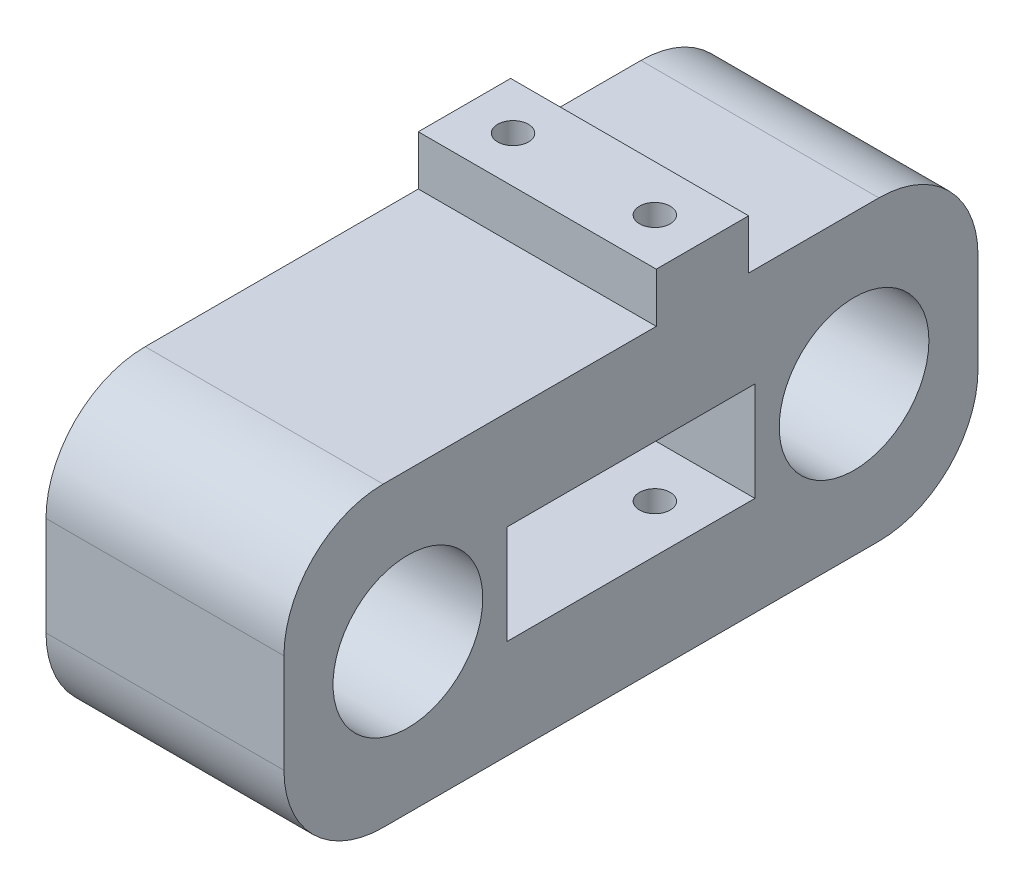
ISO-10303-21;
HEADER;
FILE_DESCRIPTION(('STEP AP214'),'2;1');
FILE_NAME('part.step','',(''),(''),'','','');
FILE_SCHEMA(('AUTOMOTIVE_DESIGN { 1 0 10303 214 1 1 1 1 }'));
ENDSEC;
DATA;
#1=APPLICATION_CONTEXT('core data for automotive mechanical design processes');
#2=APPLICATION_PROTOCOL_DEFINITION('international standard','automotive_design',2000,#1);
#3=PRODUCT_CONTEXT('',#1,'mechanical');
#4=PRODUCT('Part','Part','',(#3));
#5=PRODUCT_RELATED_PRODUCT_CATEGORY('part','',(#4));
#6=PRODUCT_DEFINITION_FORMATION('','',#4);
#7=PRODUCT_DEFINITION_CONTEXT('part definition',#1,'design');
#8=PRODUCT_DEFINITION('design','',#6,#7);
#9=PRODUCT_DEFINITION_SHAPE('','',#8);
#10=(LENGTH_UNIT() NAMED_UNIT(*) SI_UNIT(.MILLI.,.METRE.));
#11=(NAMED_UNIT(*) PLANE_ANGLE_UNIT() SI_UNIT($,.RADIAN.));
#12=(NAMED_UNIT(*) SI_UNIT($,.STERADIAN.) SOLID_ANGLE_UNIT());
#13=UNCERTAINTY_MEASURE_WITH_UNIT(LENGTH_MEASURE(1.E-05),#10,'distance_accuracy_value','');
#14=(GEOMETRIC_REPRESENTATION_CONTEXT(3) GLOBAL_UNCERTAINTY_ASSIGNED_CONTEXT((#13)) GLOBAL_UNIT_ASSIGNED_CONTEXT((#10,
#11,#12)) REPRESENTATION_CONTEXT('',''));
#15=CARTESIAN_POINT('',(0.,0.,0.));
#16=DIRECTION('',(0.,0.,1.));
#17=DIRECTION('',(1.,0.,0.));
#18=AXIS2_PLACEMENT_3D('',#15,#16,#17);
#19=CARTESIAN_POINT('',(0.,30.,0.));
#20=DIRECTION('',(0.,1.,0.));
#21=DIRECTION('',(0.,0.,1.));
#22=AXIS2_PLACEMENT_3D('',#19,#20,#21);
#23=PLANE('',#22);
#24=DIRECTION('',(0.,0.,-1.));
#25=VECTOR('',#24,1.);
#26=CARTESIAN_POINT('',(32.2419006479482,30.,-10.5226781857451));
#27=LINE('',#26,#25);
#28=CARTESIAN_POINT('',(32.2419006479482,30.,12.6108485091737));
#29=VERTEX_POINT('',#28);
#30=CARTESIAN_POINT('',(32.2419006479482,30.,-0.522678185745104));
#31=VERTEX_POINT('',#30);
#32=EDGE_CURVE('E227',#29,#31,#27,.T.);
#33=ORIENTED_EDGE('',*,*,#32,.T.);
#34=DIRECTION('',(-1.,0.,0.));
#35=VECTOR('',#34,1.);
#36=CARTESIAN_POINT('',(8.24190064794816,30.,-0.522678185745104));
#37=LINE('',#36,#35);
#38=CARTESIAN_POINT('',(8.24190064794817,30.,-0.522678185745104));
#39=VERTEX_POINT('',#38);
#40=EDGE_CURVE('E11',#31,#39,#37,.T.);
#41=ORIENTED_EDGE('',*,*,#40,.T.);
#42=DIRECTION('',(0.,0.,1.));
#43=VECTOR('',#42,1.);
#44=CARTESIAN_POINT('',(8.24190064794816,30.,-10.5226781857451));
#45=LINE('',#44,#43);
#46=CARTESIAN_POINT('',(8.24190064794817,30.,12.6108485091737));
#47=VERTEX_POINT('',#46);
#48=EDGE_CURVE('E225',#39,#47,#45,.T.);
#49=ORIENTED_EDGE('',*,*,#48,.T.);
#50=DIRECTION('',(-1.,0.,0.));
#51=VECTOR('',#50,1.);
#52=CARTESIAN_POINT('',(32.2419006479482,30.,12.6108485091738));
#53=LINE('',#52,#51);
#54=EDGE_CURVE('E174',#29,#47,#53,.T.);
#55=ORIENTED_EDGE('',*,*,#54,.F.);
#56=EDGE_LOOP('',(#33,#41,#49,#55));
#57=FACE_BOUND('',#56,.T.);
#58=ADVANCED_FACE('F35',(#57),#23,.T.);
#59=CARTESIAN_POINT('',(8.24190064794816,30.,-10.5226781857451));
#60=DIRECTION('',(1.,0.,0.));
#61=DIRECTION('',(0.,0.,-1.));
#62=AXIS2_PLACEMENT_3D('',#59,#60,#61);
#63=PLANE('',#62);
#64=DIRECTION('',(0.,0.,1.));
#65=VECTOR('',#64,1.);
#66=CARTESIAN_POINT('',(8.24190064794816,20.0000000000204,36.9773218142543));
#67=LINE('',#66,#65);
#68=CARTESIAN_POINT('',(8.24190064794815,20.0000000000204,11.9773218142546));
#69=VERTEX_POINT('',#68);
#70=CARTESIAN_POINT('',(8.24190064794816,20.0000000000204,36.9773218142543));
#71=VERTEX_POINT('',#70);
#72=EDGE_CURVE('E193',#69,#71,#67,.T.);
#73=ORIENTED_EDGE('',*,*,#72,.T.);
#74=DIRECTION('',(0.,-1.,0.));
#75=VECTOR('',#74,1.);
#76=CARTESIAN_POINT('',(8.24190064794816,20.0000000000204,36.9773218142543));
#77=LINE('',#76,#75);
#78=CARTESIAN_POINT('',(8.24190064794816,10.0000000000195,36.9773218142543));
#79=VERTEX_POINT('',#78);
#80=EDGE_CURVE('E183',#71,#79,#77,.T.);
#81=ORIENTED_EDGE('',*,*,#80,.T.);
#82=DIRECTION('',(0.,0.,-1.));
#83=VECTOR('',#82,1.);
#84=CARTESIAN_POINT('',(8.24190064794816,10.0000000000195,36.9773218142543));
#85=LINE('',#84,#83);
#86=CARTESIAN_POINT('',(8.24190064794817,10.0000000000195,11.9773218142546));
#87=VERTEX_POINT('',#86);
#88=EDGE_CURVE('E186',#79,#87,#85,.T.);
#89=ORIENTED_EDGE('',*,*,#88,.T.);
#90=DIRECTION('',(0.,1.,0.));
#91=VECTOR('',#90,1.);
#92=CARTESIAN_POINT('',(8.24190064794815,20.0000000000204,11.9773218142546));
#93=LINE('',#92,#91);
#94=EDGE_CURVE('E190',#87,#69,#93,.T.);
#95=ORIENTED_EDGE('',*,*,#94,.T.);
#96=EDGE_LOOP('',(#73,#81,#89,#95));
#97=FACE_BOUND('',#96,.T.);
#98=CARTESIAN_POINT('',(8.24190064794816,15.,46.9773218142549));
#99=DIRECTION('',(1.,0.,0.));
#100=DIRECTION('',(0.,0.,-1.));
#101=AXIS2_PLACEMENT_3D('',#98,#99,#100);
#102=CIRCLE('',#101,7.55);
#103=CARTESIAN_POINT('',(8.24190064794816,15.,39.4273218142549));
#104=VERTEX_POINT('',#103);
#105=EDGE_CURVE('E213',#104,#104,#102,.T.);
#106=ORIENTED_EDGE('',*,*,#105,.T.);
#107=EDGE_LOOP('',(#106));
#108=FACE_BOUND('',#107,.T.);
#109=CARTESIAN_POINT('',(8.24190064794815,15.,1.9773218142549));
#110=DIRECTION('',(1.,0.,0.));
#111=DIRECTION('',(0.,0.,-1.));
#112=AXIS2_PLACEMENT_3D('',#109,#110,#111);
#113=CIRCLE('',#112,7.55);
#114=CARTESIAN_POINT('',(8.24190064794815,15.,-5.5726781857451));
#115=VERTEX_POINT('',#114);
#116=EDGE_CURVE('E220',#115,#115,#113,.T.);
#117=ORIENTED_EDGE('',*,*,#116,.T.);
#118=EDGE_LOOP('',(#117));
#119=FACE_BOUND('',#118,.T.);
#120=DIRECTION('',(0.,0.,1.));
#121=VECTOR('',#120,1.);
#122=CARTESIAN_POINT('',(8.24190064794816,0.,-10.5226781857451));
#123=LINE('',#122,#121);
#124=CARTESIAN_POINT('',(8.24190064794817,0.,-0.522678185745104));
#125=VERTEX_POINT('',#124);
#126=CARTESIAN_POINT('',(8.24190064794817,0.,49.4773218142549));
#127=VERTEX_POINT('',#126);
#128=EDGE_CURVE('E216',#125,#127,#123,.T.);
#129=ORIENTED_EDGE('',*,*,#128,.T.);
#130=CARTESIAN_POINT('',(8.24190064794817,10.,49.4773218142549));
#131=DIRECTION('',(1.,0.,0.));
#132=DIRECTION('',(0.,0.,-1.));
#133=AXIS2_PLACEMENT_3D('',#130,#131,#132);
#134=CIRCLE('',#133,10.);
#135=CARTESIAN_POINT('',(8.24190064794817,10.,59.4773218142549));
#136=VERTEX_POINT('',#135);
#137=EDGE_CURVE('E267',#127,#136,#134,.F.);
#138=ORIENTED_EDGE('',*,*,#137,.T.);
#139=DIRECTION('',(0.,-1.,0.));
#140=VECTOR('',#139,1.);
#141=CARTESIAN_POINT('',(8.24190064794817,30.,59.4773218142549));
#142=LINE('',#141,#140);
#143=CARTESIAN_POINT('',(8.24190064794817,20.,59.4773218142549));
#144=VERTEX_POINT('',#143);
#145=EDGE_CURVE('E243',#144,#136,#142,.T.);
#146=ORIENTED_EDGE('',*,*,#145,.F.);
#147=CARTESIAN_POINT('',(8.24190064794817,20.,49.4773218142549));
#148=DIRECTION('',(1.,0.,0.));
#149=DIRECTION('',(0.,0.,-1.));
#150=AXIS2_PLACEMENT_3D('',#147,#148,#149);
#151=CIRCLE('',#150,10.);
#152=CARTESIAN_POINT('',(8.24190064794817,30.,49.4773218142549));
#153=VERTEX_POINT('',#152);
#154=EDGE_CURVE('E265',#144,#153,#151,.F.);
#155=ORIENTED_EDGE('',*,*,#154,.T.);
#156=CARTESIAN_POINT('',(8.24190064794817,30.,21.928286607661));
#157=VERTEX_POINT('',#156);
#158=EDGE_CURVE('E228',#157,#153,#45,.T.);
#159=ORIENTED_EDGE('',*,*,#158,.F.);
#160=DIRECTION('',(0.,-1.,0.));
#161=VECTOR('',#160,1.);
#162=CARTESIAN_POINT('',(8.24190064794817,35.,21.928286607661));
#163=LINE('',#162,#161);
#164=CARTESIAN_POINT('',(8.24190064794817,35.,21.928286607661));
#165=VERTEX_POINT('',#164);
#166=EDGE_CURVE('E158',#165,#157,#163,.T.);
#167=ORIENTED_EDGE('',*,*,#166,.F.);
#168=DIRECTION('',(0.,0.,1.));
#169=VECTOR('',#168,1.);
#170=CARTESIAN_POINT('',(8.24190064794817,35.,12.6108485091737));
#171=LINE('',#170,#169);
#172=CARTESIAN_POINT('',(8.24190064794817,35.,12.6108485091737));
#173=VERTEX_POINT('',#172);
#174=EDGE_CURVE('E149',#173,#165,#171,.T.);
#175=ORIENTED_EDGE('',*,*,#174,.F.);
#176=DIRECTION('',(0.,-1.,0.));
#177=VECTOR('',#176,1.);
#178=CARTESIAN_POINT('',(8.24190064794817,35.,12.6108485091737));
#179=LINE('',#178,#177);
#180=EDGE_CURVE('E154',#173,#47,#179,.T.);
#181=ORIENTED_EDGE('',*,*,#180,.T.);
#182=ORIENTED_EDGE('',*,*,#48,.F.);
#183=CARTESIAN_POINT('',(8.24190064794817,20.,-0.522678185745104));
#184=DIRECTION('',(1.,0.,0.));
#185=DIRECTION('',(0.,0.,-1.));
#186=AXIS2_PLACEMENT_3D('',#183,#184,#185);
#187=CIRCLE('',#186,10.);
#188=CARTESIAN_POINT('',(8.24190064794816,20.,-10.5226781857451));
#189=VERTEX_POINT('',#188);
#190=EDGE_CURVE('E58',#39,#189,#187,.F.);
#191=ORIENTED_EDGE('',*,*,#190,.T.);
#192=DIRECTION('',(0.,-1.,0.));
#193=VECTOR('',#192,1.);
#194=CARTESIAN_POINT('',(8.24190064794816,30.,-10.5226781857451));
#195=LINE('',#194,#193);
#196=CARTESIAN_POINT('',(8.24190064794816,10.,-10.5226781857451));
#197=VERTEX_POINT('',#196);
#198=EDGE_CURVE('E231',#189,#197,#195,.T.);
#199=ORIENTED_EDGE('',*,*,#198,.T.);
#200=CARTESIAN_POINT('',(8.24190064794817,10.,-0.522678185745104));
#201=DIRECTION('',(1.,0.,0.));
#202=DIRECTION('',(0.,0.,-1.));
#203=AXIS2_PLACEMENT_3D('',#200,#201,#202);
#204=CIRCLE('',#203,10.);
#205=EDGE_CURVE('E50',#197,#125,#204,.F.);
#206=ORIENTED_EDGE('',*,*,#205,.T.);
#207=EDGE_LOOP('',(#129,#138,#146,#155,#159,#167,#175,#181,#182,#191,#199,#206));
#208=FACE_BOUND('',#207,.T.);
#209=ADVANCED_FACE('F152',(#97,#108,#119,#208),#63,.F.);
#210=CARTESIAN_POINT('',(8.24190064794817,30.,59.4773218142549));
#211=DIRECTION('',(0.,0.,-1.));
#212=DIRECTION('',(-1.,0.,0.));
#213=AXIS2_PLACEMENT_3D('',#210,#211,#212);
#214=PLANE('',#213);
#215=ORIENTED_EDGE('',*,*,#145,.T.);
#216=DIRECTION('',(1.,0.,0.));
#217=VECTOR('',#216,1.);
#218=CARTESIAN_POINT('',(8.24190064794817,10.,59.4773218142549));
#219=LINE('',#218,#217);
#220=CARTESIAN_POINT('',(32.2419006479482,10.,59.4773218142549));
#221=VERTEX_POINT('',#220);
#222=EDGE_CURVE('E248',#136,#221,#219,.T.);
#223=ORIENTED_EDGE('',*,*,#222,.T.);
#224=DIRECTION('',(0.,-1.,0.));
#225=VECTOR('',#224,1.);
#226=CARTESIAN_POINT('',(32.2419006479482,30.,59.4773218142549));
#227=LINE('',#226,#225);
#228=CARTESIAN_POINT('',(32.2419006479482,20.,59.4773218142549));
#229=VERTEX_POINT('',#228);
#230=EDGE_CURVE('E240',#229,#221,#227,.T.);
#231=ORIENTED_EDGE('',*,*,#230,.F.);
#232=DIRECTION('',(1.,0.,0.));
#233=VECTOR('',#232,1.);
#234=CARTESIAN_POINT('',(8.24190064794817,20.,59.4773218142549));
#235=LINE('',#234,#233);
#236=EDGE_CURVE('E246',#229,#144,#235,.F.);
#237=ORIENTED_EDGE('',*,*,#236,.T.);
#238=EDGE_LOOP('',(#215,#223,#231,#237));
#239=FACE_BOUND('',#238,.T.);
#240=ADVANCED_FACE('F294',(#239),#214,.F.);
#241=CARTESIAN_POINT('',(32.2419006479482,30.,-10.5226781857451));
#242=DIRECTION('',(-1.,0.,0.));
#243=DIRECTION('',(0.,0.,1.));
#244=AXIS2_PLACEMENT_3D('',#241,#242,#243);
#245=PLANE('',#244);
#246=DIRECTION('',(0.,0.,-1.));
#247=VECTOR('',#246,1.);
#248=CARTESIAN_POINT('',(32.2419006479482,10.0000000000195,36.9773218142543));
#249=LINE('',#248,#247);
#250=CARTESIAN_POINT('',(32.2419006479482,10.0000000000195,36.9773218142543));
#251=VERTEX_POINT('',#250);
#252=CARTESIAN_POINT('',(32.2419006479482,10.0000000000195,11.9773218142546));
#253=VERTEX_POINT('',#252);
#254=EDGE_CURVE('E177',#251,#253,#249,.T.);
#255=ORIENTED_EDGE('',*,*,#254,.F.);
#256=DIRECTION('',(0.,-1.,0.));
#257=VECTOR('',#256,1.);
#258=CARTESIAN_POINT('',(32.2419006479482,20.0000000000204,36.9773218142543));
#259=LINE('',#258,#257);
#260=CARTESIAN_POINT('',(32.2419006479482,20.0000000000204,36.9773218142543));
#261=VERTEX_POINT('',#260);
#262=EDGE_CURVE('E175',#261,#251,#259,.T.);
#263=ORIENTED_EDGE('',*,*,#262,.F.);
#264=DIRECTION('',(0.,0.,1.));
#265=VECTOR('',#264,1.);
#266=CARTESIAN_POINT('',(32.2419006479482,20.0000000000204,36.9773218142543));
#267=LINE('',#266,#265);
#268=CARTESIAN_POINT('',(32.2419006479482,20.0000000000204,11.9773218142546));
#269=VERTEX_POINT('',#268);
#270=EDGE_CURVE('E187',#269,#261,#267,.T.);
#271=ORIENTED_EDGE('',*,*,#270,.F.);
#272=DIRECTION('',(0.,1.,0.));
#273=VECTOR('',#272,1.);
#274=CARTESIAN_POINT('',(32.2419006479482,20.0000000000204,11.9773218142546));
#275=LINE('',#274,#273);
#276=EDGE_CURVE('E199',#253,#269,#275,.T.);
#277=ORIENTED_EDGE('',*,*,#276,.F.);
#278=EDGE_LOOP('',(#255,#263,#271,#277));
#279=FACE_BOUND('',#278,.T.);
#280=CARTESIAN_POINT('',(32.2419006479482,15.,46.9773218142549));
#281=DIRECTION('',(1.,0.,0.));
#282=DIRECTION('',(0.,0.,-1.));
#283=AXIS2_PLACEMENT_3D('',#280,#281,#282);
#284=CIRCLE('',#283,7.55);
#285=CARTESIAN_POINT('',(32.2419006479482,15.,39.4273218142549));
#286=VERTEX_POINT('',#285);
#287=EDGE_CURVE('E217',#286,#286,#284,.T.);
#288=ORIENTED_EDGE('',*,*,#287,.F.);
#289=EDGE_LOOP('',(#288));
#290=FACE_BOUND('',#289,.T.);
#291=CARTESIAN_POINT('',(32.2419006479482,15.,1.9773218142549));
#292=DIRECTION('',(1.,0.,0.));
#293=DIRECTION('',(0.,0.,-1.));
#294=AXIS2_PLACEMENT_3D('',#291,#292,#293);
#295=CIRCLE('',#294,7.55);
#296=CARTESIAN_POINT('',(32.2419006479482,15.,-5.5726781857451));
#297=VERTEX_POINT('',#296);
#298=EDGE_CURVE('E206',#297,#297,#295,.T.);
#299=ORIENTED_EDGE('',*,*,#298,.F.);
#300=EDGE_LOOP('',(#299));
#301=FACE_BOUND('',#300,.T.);
#302=ORIENTED_EDGE('',*,*,#230,.T.);
#303=CARTESIAN_POINT('',(32.2419006479482,10.,49.4773218142549));
#304=DIRECTION('',(-1.,0.,0.));
#305=DIRECTION('',(0.,0.,1.));
#306=AXIS2_PLACEMENT_3D('',#303,#304,#305);
#307=CIRCLE('',#306,10.);
#308=CARTESIAN_POINT('',(32.2419006479482,0.,49.4773218142549));
#309=VERTEX_POINT('',#308);
#310=EDGE_CURVE('E257',#221,#309,#307,.F.);
#311=ORIENTED_EDGE('',*,*,#310,.T.);
#312=DIRECTION('',(0.,0.,-1.));
#313=VECTOR('',#312,1.);
#314=CARTESIAN_POINT('',(32.2419006479482,0.,-10.5226781857451));
#315=LINE('',#314,#313);
#316=CARTESIAN_POINT('',(32.2419006479482,0.,-0.522678185745104));
#317=VERTEX_POINT('',#316);
#318=EDGE_CURVE('E233',#309,#317,#315,.T.);
#319=ORIENTED_EDGE('',*,*,#318,.T.);
#320=CARTESIAN_POINT('',(32.2419006479482,10.,-0.522678185745104));
#321=DIRECTION('',(-1.,0.,0.));
#322=DIRECTION('',(0.,0.,1.));
#323=AXIS2_PLACEMENT_3D('',#320,#321,#322);
#324=CIRCLE('',#323,10.);
#325=CARTESIAN_POINT('',(32.2419006479482,10.,-10.5226781857451));
#326=VERTEX_POINT('',#325);
#327=EDGE_CURVE('E253',#317,#326,#324,.F.);
#328=ORIENTED_EDGE('',*,*,#327,.T.);
#329=DIRECTION('',(0.,-1.,0.));
#330=VECTOR('',#329,1.);
#331=CARTESIAN_POINT('',(32.2419006479482,30.,-10.5226781857451));
#332=LINE('',#331,#330);
#333=CARTESIAN_POINT('',(32.2419006479482,20.,-10.5226781857451));
#334=VERTEX_POINT('',#333);
#335=EDGE_CURVE('E237',#334,#326,#332,.T.);
#336=ORIENTED_EDGE('',*,*,#335,.F.);
#337=CARTESIAN_POINT('',(32.2419006479482,20.,-0.522678185745104));
#338=DIRECTION('',(-1.,0.,0.));
#339=DIRECTION('',(0.,0.,1.));
#340=AXIS2_PLACEMENT_3D('',#337,#338,#339);
#341=CIRCLE('',#340,10.);
#342=EDGE_CURVE('E251',#334,#31,#341,.F.);
#343=ORIENTED_EDGE('',*,*,#342,.T.);
#344=ORIENTED_EDGE('',*,*,#32,.F.);
#345=DIRECTION('',(0.,-1.,0.));
#346=VECTOR('',#345,1.);
#347=CARTESIAN_POINT('',(32.2419006479482,35.,12.6108485091738));
#348=LINE('',#347,#346);
#349=CARTESIAN_POINT('',(32.2419006479482,35.,12.6108485091738));
#350=VERTEX_POINT('',#349);
#351=EDGE_CURVE('E313',#350,#29,#348,.T.);
#352=ORIENTED_EDGE('',*,*,#351,.F.);
#353=DIRECTION('',(0.,0.,-1.));
#354=VECTOR('',#353,1.);
#355=CARTESIAN_POINT('',(32.2419006479482,35.,21.928286607661));
#356=LINE('',#355,#354);
#357=CARTESIAN_POINT('',(32.2419006479482,35.,21.928286607661));
#358=VERTEX_POINT('',#357);
#359=EDGE_CURVE('E167',#358,#350,#356,.T.);
#360=ORIENTED_EDGE('',*,*,#359,.F.);
#361=DIRECTION('',(0.,-1.,0.));
#362=VECTOR('',#361,1.);
#363=CARTESIAN_POINT('',(32.2419006479482,35.,21.928286607661));
#364=LINE('',#363,#362);
#365=CARTESIAN_POINT('',(32.2419006479482,30.,21.928286607661));
#366=VERTEX_POINT('',#365);
#367=EDGE_CURVE('E179',#358,#366,#364,.T.);
#368=ORIENTED_EDGE('',*,*,#367,.T.);
#369=CARTESIAN_POINT('',(32.2419006479482,30.,49.4773218142549));
#370=VERTEX_POINT('',#369);
#371=EDGE_CURVE('E229',#370,#366,#27,.T.);
#372=ORIENTED_EDGE('',*,*,#371,.F.);
#373=CARTESIAN_POINT('',(32.2419006479482,20.,49.4773218142549));
#374=DIRECTION('',(-1.,0.,0.));
#375=DIRECTION('',(0.,0.,1.));
#376=AXIS2_PLACEMENT_3D('',#373,#374,#375);
#377=CIRCLE('',#376,10.);
#378=EDGE_CURVE('E255',#370,#229,#377,.F.);
#379=ORIENTED_EDGE('',*,*,#378,.T.);
#380=EDGE_LOOP('',(#302,#311,#319,#328,#336,#343,#344,#352,#360,#368,#372,#379));
#381=FACE_BOUND('',#380,.T.);
#382=ADVANCED_FACE('F286',(#279,#290,#301,#381),#245,.F.);
#383=CARTESIAN_POINT('',(8.24190064794816,30.,-10.5226781857451));
#384=DIRECTION('',(0.,0.,1.));
#385=DIRECTION('',(1.,0.,0.));
#386=AXIS2_PLACEMENT_3D('',#383,#384,#385);
#387=PLANE('',#386);
#388=ORIENTED_EDGE('',*,*,#335,.T.);
#389=DIRECTION('',(-1.,0.,0.));
#390=VECTOR('',#389,1.);
#391=CARTESIAN_POINT('',(8.24190064794816,10.,-10.5226781857451));
#392=LINE('',#391,#390);
#393=EDGE_CURVE('E43',#326,#197,#392,.T.);
#394=ORIENTED_EDGE('',*,*,#393,.T.);
#395=ORIENTED_EDGE('',*,*,#198,.F.);
#396=DIRECTION('',(-1.,0.,0.));
#397=VECTOR('',#396,1.);
#398=CARTESIAN_POINT('',(32.2419006479482,20.,-10.5226781857451));
#399=LINE('',#398,#397);
#400=EDGE_CURVE('E272',#189,#334,#399,.F.);
#401=ORIENTED_EDGE('',*,*,#400,.T.);
#402=EDGE_LOOP('',(#388,#394,#395,#401));
#403=FACE_BOUND('',#402,.T.);
#404=ADVANCED_FACE('F274',(#403),#387,.F.);
#405=ORIENTED_EDGE('',*,*,#158,.T.);
#406=DIRECTION('',(1.,0.,0.));
#407=VECTOR('',#406,1.);
#408=CARTESIAN_POINT('',(32.2419006479482,30.,49.4773218142549));
#409=LINE('',#408,#407);
#410=EDGE_CURVE('E269',#153,#370,#409,.T.);
#411=ORIENTED_EDGE('',*,*,#410,.T.);
#412=ORIENTED_EDGE('',*,*,#371,.T.);
#413=DIRECTION('',(1.,0.,0.));
#414=VECTOR('',#413,1.);
#415=CARTESIAN_POINT('',(8.24190064794817,30.,21.928286607661));
#416=LINE('',#415,#414);
#417=EDGE_CURVE('E171',#157,#366,#416,.T.);
#418=ORIENTED_EDGE('',*,*,#417,.F.);
#419=EDGE_LOOP('',(#405,#411,#412,#418));
#420=FACE_BOUND('',#419,.T.);
#421=ADVANCED_FACE('F302',(#420),#23,.T.);
#422=CARTESIAN_POINT('',(0.,0.,0.));
#423=DIRECTION('',(0.,1.,0.));
#424=DIRECTION('',(0.,0.,1.));
#425=AXIS2_PLACEMENT_3D('',#422,#423,#424);
#426=PLANE('',#425);
#427=ORIENTED_EDGE('',*,*,#318,.F.);
#428=DIRECTION('',(1.,0.,0.));
#429=VECTOR('',#428,1.);
#430=CARTESIAN_POINT('',(0.,0.,49.4773218142549));
#431=LINE('',#430,#429);
#432=EDGE_CURVE('E261',#309,#127,#431,.F.);
#433=ORIENTED_EDGE('',*,*,#432,.T.);
#434=ORIENTED_EDGE('',*,*,#128,.F.);
#435=DIRECTION('',(-1.,0.,0.));
#436=VECTOR('',#435,1.);
#437=CARTESIAN_POINT('',(0.,0.,-0.522678185745104));
#438=LINE('',#437,#436);
#439=EDGE_CURVE('E259',#125,#317,#438,.F.);
#440=ORIENTED_EDGE('',*,*,#439,.T.);
#441=EDGE_LOOP('',(#427,#433,#434,#440));
#442=FACE_BOUND('',#441,.T.);
#443=ADVANCED_FACE('F282',(#442),#426,.F.);
#444=CARTESIAN_POINT('',(8.24190064794815,15.,1.9773218142549));
#445=DIRECTION('',(1.,0.,0.));
#446=DIRECTION('',(0.,0.,-1.));
#447=AXIS2_PLACEMENT_3D('',#444,#445,#446);
#448=CYLINDRICAL_SURFACE('',#447,7.55);
#449=ORIENTED_EDGE('',*,*,#116,.F.);
#450=EDGE_LOOP('',(#449));
#451=FACE_BOUND('',#450,.T.);
#452=ORIENTED_EDGE('',*,*,#298,.T.);
#453=EDGE_LOOP('',(#452));
#454=FACE_BOUND('',#453,.T.);
#455=ADVANCED_FACE('F402',(#451,#454),#448,.F.);
#456=CARTESIAN_POINT('',(8.24190064794816,15.,46.9773218142549));
#457=DIRECTION('',(1.,0.,0.));
#458=DIRECTION('',(0.,0.,-1.));
#459=AXIS2_PLACEMENT_3D('',#456,#457,#458);
#460=CYLINDRICAL_SURFACE('',#459,7.55);
#461=ORIENTED_EDGE('',*,*,#105,.F.);
#462=EDGE_LOOP('',(#461));
#463=FACE_BOUND('',#462,.T.);
#464=ORIENTED_EDGE('',*,*,#287,.T.);
#465=EDGE_LOOP('',(#464));
#466=FACE_BOUND('',#465,.T.);
#467=ADVANCED_FACE('F383',(#463,#466),#460,.F.);
#468=CARTESIAN_POINT('',(8.24190064794816,20.0000000000204,36.9773218142543));
#469=DIRECTION('',(0.,0.,1.));
#470=DIRECTION('',(1.,0.,0.));
#471=AXIS2_PLACEMENT_3D('',#468,#469,#470);
#472=PLANE('',#471);
#473=ORIENTED_EDGE('',*,*,#262,.T.);
#474=DIRECTION('',(1.,0.,0.));
#475=VECTOR('',#474,1.);
#476=CARTESIAN_POINT('',(8.24190064794816,10.0000000000195,36.9773218142543));
#477=LINE('',#476,#475);
#478=EDGE_CURVE('E195',#79,#251,#477,.T.);
#479=ORIENTED_EDGE('',*,*,#478,.F.);
#480=ORIENTED_EDGE('',*,*,#80,.F.);
#481=DIRECTION('',(1.,0.,0.));
#482=VECTOR('',#481,1.);
#483=CARTESIAN_POINT('',(8.24190064794816,20.0000000000204,36.9773218142543));
#484=LINE('',#483,#482);
#485=EDGE_CURVE('E204',#71,#261,#484,.T.);
#486=ORIENTED_EDGE('',*,*,#485,.T.);
#487=EDGE_LOOP('',(#473,#479,#480,#486));
#488=FACE_BOUND('',#487,.T.);
#489=ADVANCED_FACE('F372',(#488),#472,.F.);
#490=CARTESIAN_POINT('',(8.24190064794816,20.0000000000204,36.9773218142543));
#491=DIRECTION('',(0.,1.,0.));
#492=DIRECTION('',(0.,0.,1.));
#493=AXIS2_PLACEMENT_3D('',#490,#491,#492);
#494=PLANE('',#493);
#495=CARTESIAN_POINT('',(27.4411745654533,20.0000000000204,17.2695675584174));
#496=DIRECTION('',(0.,1.,0.));
#497=DIRECTION('',(0.,0.,1.));
#498=AXIS2_PLACEMENT_3D('',#495,#496,#497);
#499=CIRCLE('',#498,1.55);
#500=CARTESIAN_POINT('',(27.4411745654533,20.0000000000204,18.8195675584174));
#501=VERTEX_POINT('',#500);
#502=EDGE_CURVE('E309',#501,#501,#499,.T.);
#503=ORIENTED_EDGE('',*,*,#502,.T.);
#504=EDGE_LOOP('',(#503));
#505=FACE_BOUND('',#504,.T.);
#506=CARTESIAN_POINT('',(13.1411745654533,20.0000000000204,17.2695675584174));
#507=DIRECTION('',(0.,1.,0.));
#508=DIRECTION('',(0.,0.,1.));
#509=AXIS2_PLACEMENT_3D('',#506,#507,#508);
#510=CIRCLE('',#509,1.55);
#511=CARTESIAN_POINT('',(13.1411745654533,20.0000000000204,18.8195675584174));
#512=VERTEX_POINT('',#511);
#513=EDGE_CURVE('E322',#512,#512,#510,.T.);
#514=ORIENTED_EDGE('',*,*,#513,.T.);
#515=EDGE_LOOP('',(#514));
#516=FACE_BOUND('',#515,.T.);
#517=ORIENTED_EDGE('',*,*,#270,.T.);
#518=ORIENTED_EDGE('',*,*,#485,.F.);
#519=ORIENTED_EDGE('',*,*,#72,.F.);
#520=DIRECTION('',(1.,0.,0.));
#521=VECTOR('',#520,1.);
#522=CARTESIAN_POINT('',(8.24190064794815,20.0000000000204,11.9773218142546));
#523=LINE('',#522,#521);
#524=EDGE_CURVE('E207',#69,#269,#523,.T.);
#525=ORIENTED_EDGE('',*,*,#524,.T.);
#526=EDGE_LOOP('',(#517,#518,#519,#525));
#527=FACE_BOUND('',#526,.T.);
#528=ADVANCED_FACE('F374',(#505,#516,#527),#494,.F.);
#529=CARTESIAN_POINT('',(8.24190064794815,20.0000000000204,11.9773218142546));
#530=DIRECTION('',(0.,0.,-1.));
#531=DIRECTION('',(0.,1.,0.));
#532=AXIS2_PLACEMENT_3D('',#529,#530,#531);
#533=PLANE('',#532);
#534=ORIENTED_EDGE('',*,*,#276,.T.);
#535=ORIENTED_EDGE('',*,*,#524,.F.);
#536=ORIENTED_EDGE('',*,*,#94,.F.);
#537=DIRECTION('',(1.,0.,0.));
#538=VECTOR('',#537,1.);
#539=CARTESIAN_POINT('',(8.24190064794815,10.0000000000195,11.9773218142546));
#540=LINE('',#539,#538);
#541=EDGE_CURVE('E209',#87,#253,#540,.T.);
#542=ORIENTED_EDGE('',*,*,#541,.T.);
#543=EDGE_LOOP('',(#534,#535,#536,#542));
#544=FACE_BOUND('',#543,.T.);
#545=ADVANCED_FACE('F354',(#544),#533,.F.);
#546=CARTESIAN_POINT('',(8.24190064794816,10.0000000000195,36.9773218142543));
#547=DIRECTION('',(0.,-1.,0.));
#548=DIRECTION('',(0.,0.,-1.));
#549=AXIS2_PLACEMENT_3D('',#546,#547,#548);
#550=PLANE('',#549);
#551=CARTESIAN_POINT('',(27.4411745654533,10.0000000000195,17.2695675584174));
#552=DIRECTION('',(0.,-1.,0.));
#553=DIRECTION('',(0.,0.,-1.));
#554=AXIS2_PLACEMENT_3D('',#551,#552,#553);
#555=CIRCLE('',#554,1.55);
#556=CARTESIAN_POINT('',(27.4411745654533,10.0000000000195,15.7195675584174));
#557=VERTEX_POINT('',#556);
#558=EDGE_CURVE('E319',#557,#557,#555,.T.);
#559=ORIENTED_EDGE('',*,*,#558,.T.);
#560=EDGE_LOOP('',(#559));
#561=FACE_BOUND('',#560,.T.);
#562=CARTESIAN_POINT('',(13.1411745654533,10.0000000000195,17.2695675584174));
#563=DIRECTION('',(0.,-1.,0.));
#564=DIRECTION('',(0.,0.,-1.));
#565=AXIS2_PLACEMENT_3D('',#562,#563,#564);
#566=CIRCLE('',#565,1.55);
#567=CARTESIAN_POINT('',(13.1411745654533,10.0000000000195,15.7195675584174));
#568=VERTEX_POINT('',#567);
#569=EDGE_CURVE('E325',#568,#568,#566,.T.);
#570=ORIENTED_EDGE('',*,*,#569,.T.);
#571=EDGE_LOOP('',(#570));
#572=FACE_BOUND('',#571,.T.);
#573=ORIENTED_EDGE('',*,*,#254,.T.);
#574=ORIENTED_EDGE('',*,*,#541,.F.);
#575=ORIENTED_EDGE('',*,*,#88,.F.);
#576=ORIENTED_EDGE('',*,*,#478,.T.);
#577=EDGE_LOOP('',(#573,#574,#575,#576));
#578=FACE_BOUND('',#577,.T.);
#579=ADVANCED_FACE('F351',(#561,#572,#578),#550,.F.);
#580=CARTESIAN_POINT('',(32.2419006479482,35.,12.6108485091738));
#581=DIRECTION('',(0.,0.,1.));
#582=DIRECTION('',(1.,0.,0.));
#583=AXIS2_PLACEMENT_3D('',#580,#581,#582);
#584=PLANE('',#583);
#585=ORIENTED_EDGE('',*,*,#54,.T.);
#586=ORIENTED_EDGE('',*,*,#180,.F.);
#587=DIRECTION('',(-1.,0.,0.));
#588=VECTOR('',#587,1.);
#589=CARTESIAN_POINT('',(32.2419006479482,35.,12.6108485091738));
#590=LINE('',#589,#588);
#591=EDGE_CURVE('E162',#350,#173,#590,.T.);
#592=ORIENTED_EDGE('',*,*,#591,.F.);
#593=ORIENTED_EDGE('',*,*,#351,.T.);
#594=EDGE_LOOP('',(#585,#586,#592,#593));
#595=FACE_BOUND('',#594,.T.);
#596=ADVANCED_FACE('F173',(#595),#584,.F.);
#597=CARTESIAN_POINT('',(8.24190064794817,35.,21.928286607661));
#598=DIRECTION('',(0.,0.,-1.));
#599=DIRECTION('',(-1.,0.,0.));
#600=AXIS2_PLACEMENT_3D('',#597,#598,#599);
#601=PLANE('',#600);
#602=ORIENTED_EDGE('',*,*,#417,.T.);
#603=ORIENTED_EDGE('',*,*,#367,.F.);
#604=DIRECTION('',(1.,0.,0.));
#605=VECTOR('',#604,1.);
#606=CARTESIAN_POINT('',(8.24190064794817,35.,21.928286607661));
#607=LINE('',#606,#605);
#608=EDGE_CURVE('E161',#165,#358,#607,.T.);
#609=ORIENTED_EDGE('',*,*,#608,.F.);
#610=ORIENTED_EDGE('',*,*,#166,.T.);
#611=EDGE_LOOP('',(#602,#603,#609,#610));
#612=FACE_BOUND('',#611,.T.);
#613=ADVANCED_FACE('F314',(#612),#601,.F.);
#614=CARTESIAN_POINT('',(0.,35.,0.));
#615=DIRECTION('',(0.,1.,0.));
#616=DIRECTION('',(0.,0.,1.));
#617=AXIS2_PLACEMENT_3D('',#614,#615,#616);
#618=PLANE('',#617);
#619=CARTESIAN_POINT('',(27.4411745654533,35.,17.2695675584174));
#620=DIRECTION('',(0.,1.,0.));
#621=DIRECTION('',(0.,0.,1.));
#622=AXIS2_PLACEMENT_3D('',#619,#620,#621);
#623=CIRCLE('',#622,1.55);
#624=CARTESIAN_POINT('',(27.4411745654533,35.,18.8195675584174));
#625=VERTEX_POINT('',#624);
#626=EDGE_CURVE('E335',#625,#625,#623,.T.);
#627=ORIENTED_EDGE('',*,*,#626,.F.);
#628=EDGE_LOOP('',(#627));
#629=FACE_BOUND('',#628,.T.);
#630=CARTESIAN_POINT('',(13.1411745654533,35.,17.2695675584174));
#631=DIRECTION('',(0.,1.,0.));
#632=DIRECTION('',(0.,0.,1.));
#633=AXIS2_PLACEMENT_3D('',#630,#631,#632);
#634=CIRCLE('',#633,1.55);
#635=CARTESIAN_POINT('',(13.1411745654533,35.,18.8195675584174));
#636=VERTEX_POINT('',#635);
#637=EDGE_CURVE('E329',#636,#636,#634,.T.);
#638=ORIENTED_EDGE('',*,*,#637,.F.);
#639=EDGE_LOOP('',(#638));
#640=FACE_BOUND('',#639,.T.);
#641=ORIENTED_EDGE('',*,*,#591,.T.);
#642=ORIENTED_EDGE('',*,*,#174,.T.);
#643=ORIENTED_EDGE('',*,*,#608,.T.);
#644=ORIENTED_EDGE('',*,*,#359,.T.);
#645=EDGE_LOOP('',(#641,#642,#643,#644));
#646=FACE_BOUND('',#645,.T.);
#647=ADVANCED_FACE('F165',(#629,#640,#646),#618,.T.);
#648=CARTESIAN_POINT('',(13.1411745654533,4.,17.2695675584174));
#649=DIRECTION('',(0.,1.,0.));
#650=DIRECTION('',(0.,0.,1.));
#651=AXIS2_PLACEMENT_3D('',#648,#649,#650);
#652=CYLINDRICAL_SURFACE('',#651,1.55);
#653=ORIENTED_EDGE('',*,*,#637,.T.);
#654=EDGE_LOOP('',(#653));
#655=FACE_BOUND('',#654,.T.);
#656=ORIENTED_EDGE('',*,*,#513,.F.);
#657=EDGE_LOOP('',(#656));
#658=FACE_BOUND('',#657,.T.);
#659=ADVANCED_FACE('F516',(#655,#658),#652,.F.);
#660=CARTESIAN_POINT('',(27.4411745654533,4.,17.2695675584174));
#661=DIRECTION('',(0.,1.,0.));
#662=DIRECTION('',(0.,0.,1.));
#663=AXIS2_PLACEMENT_3D('',#660,#661,#662);
#664=CYLINDRICAL_SURFACE('',#663,1.55);
#665=ORIENTED_EDGE('',*,*,#626,.T.);
#666=EDGE_LOOP('',(#665));
#667=FACE_BOUND('',#666,.T.);
#668=ORIENTED_EDGE('',*,*,#502,.F.);
#669=EDGE_LOOP('',(#668));
#670=FACE_BOUND('',#669,.T.);
#671=ADVANCED_FACE('F348',(#667,#670),#664,.F.);
#672=CARTESIAN_POINT('',(13.1411745654533,4.,17.2695675584174));
#673=DIRECTION('',(0.,1.,0.));
#674=DIRECTION('',(0.,0.,1.));
#675=AXIS2_PLACEMENT_3D('',#672,#673,#674);
#676=CIRCLE('',#675,1.55);
#677=CARTESIAN_POINT('',(13.1411745654533,4.,18.8195675584174));
#678=VERTEX_POINT('',#677);
#679=EDGE_CURVE('E332',#678,#678,#676,.T.);
#680=ORIENTED_EDGE('',*,*,#679,.F.);
#681=EDGE_LOOP('',(#680));
#682=FACE_BOUND('',#681,.T.);
#683=ORIENTED_EDGE('',*,*,#569,.F.);
#684=EDGE_LOOP('',(#683));
#685=FACE_BOUND('',#684,.T.);
#686=ADVANCED_FACE('F504',(#682,#685),#652,.F.);
#687=CARTESIAN_POINT('',(13.1411745654533,4.,17.2695675584174));
#688=DIRECTION('',(0.,1.,0.));
#689=DIRECTION('',(0.,0.,1.));
#690=AXIS2_PLACEMENT_3D('',#687,#688,#689);
#691=PLANE('',#690);
#692=ORIENTED_EDGE('',*,*,#679,.T.);
#693=EDGE_LOOP('',(#692));
#694=FACE_BOUND('',#693,.T.);
#695=ADVANCED_FACE('F346',(#694),#691,.T.);
#696=CARTESIAN_POINT('',(27.4411745654533,4.,17.2695675584174));
#697=DIRECTION('',(0.,1.,0.));
#698=DIRECTION('',(0.,0.,1.));
#699=AXIS2_PLACEMENT_3D('',#696,#697,#698);
#700=CIRCLE('',#699,1.55);
#701=CARTESIAN_POINT('',(27.4411745654533,4.,18.8195675584174));
#702=VERTEX_POINT('',#701);
#703=EDGE_CURVE('E328',#702,#702,#700,.T.);
#704=ORIENTED_EDGE('',*,*,#703,.F.);
#705=EDGE_LOOP('',(#704));
#706=FACE_BOUND('',#705,.T.);
#707=ORIENTED_EDGE('',*,*,#558,.F.);
#708=EDGE_LOOP('',(#707));
#709=FACE_BOUND('',#708,.T.);
#710=ADVANCED_FACE('F343',(#706,#709),#664,.F.);
#711=CARTESIAN_POINT('',(27.4411745654533,4.,17.2695675584174));
#712=DIRECTION('',(0.,1.,0.));
#713=DIRECTION('',(0.,0.,1.));
#714=AXIS2_PLACEMENT_3D('',#711,#712,#713);
#715=PLANE('',#714);
#716=ORIENTED_EDGE('',*,*,#703,.T.);
#717=EDGE_LOOP('',(#716));
#718=FACE_BOUND('',#717,.T.);
#719=ADVANCED_FACE('F341',(#718),#715,.T.);
#720=CARTESIAN_POINT('',(8.24190064794817,10.,49.4773218142549));
#721=DIRECTION('',(1.,0.,0.));
#722=DIRECTION('',(0.,0.,-1.));
#723=AXIS2_PLACEMENT_3D('',#720,#721,#722);
#724=CYLINDRICAL_SURFACE('',#723,10.);
#725=ORIENTED_EDGE('',*,*,#137,.F.);
#726=ORIENTED_EDGE('',*,*,#432,.F.);
#727=ORIENTED_EDGE('',*,*,#310,.F.);
#728=ORIENTED_EDGE('',*,*,#222,.F.);
#729=EDGE_LOOP('',(#725,#726,#727,#728));
#730=FACE_BOUND('',#729,.T.);
#731=ADVANCED_FACE('F289',(#730),#724,.T.);
#732=CARTESIAN_POINT('',(0.,20.,49.4773218142549));
#733=DIRECTION('',(-1.,0.,0.));
#734=DIRECTION('',(0.,0.,1.));
#735=AXIS2_PLACEMENT_3D('',#732,#733,#734);
#736=CYLINDRICAL_SURFACE('',#735,10.);
#737=ORIENTED_EDGE('',*,*,#154,.F.);
#738=ORIENTED_EDGE('',*,*,#236,.F.);
#739=ORIENTED_EDGE('',*,*,#378,.F.);
#740=ORIENTED_EDGE('',*,*,#410,.F.);
#741=EDGE_LOOP('',(#737,#738,#739,#740));
#742=FACE_BOUND('',#741,.T.);
#743=ADVANCED_FACE('F298',(#742),#736,.T.);
#744=CARTESIAN_POINT('',(8.24190064794816,10.,-0.522678185745104));
#745=DIRECTION('',(-1.,0.,0.));
#746=DIRECTION('',(0.,0.,1.));
#747=AXIS2_PLACEMENT_3D('',#744,#745,#746);
#748=CYLINDRICAL_SURFACE('',#747,10.);
#749=ORIENTED_EDGE('',*,*,#327,.F.);
#750=ORIENTED_EDGE('',*,*,#439,.F.);
#751=ORIENTED_EDGE('',*,*,#205,.F.);
#752=ORIENTED_EDGE('',*,*,#393,.F.);
#753=EDGE_LOOP('',(#749,#750,#751,#752));
#754=FACE_BOUND('',#753,.T.);
#755=ADVANCED_FACE('F284',(#754),#748,.T.);
#756=CARTESIAN_POINT('',(0.,20.,-0.522678185745104));
#757=DIRECTION('',(1.,0.,0.));
#758=DIRECTION('',(0.,0.,-1.));
#759=AXIS2_PLACEMENT_3D('',#756,#757,#758);
#760=CYLINDRICAL_SURFACE('',#759,10.);
#761=ORIENTED_EDGE('',*,*,#342,.F.);
#762=ORIENTED_EDGE('',*,*,#400,.F.);
#763=ORIENTED_EDGE('',*,*,#190,.F.);
#764=ORIENTED_EDGE('',*,*,#40,.F.);
#765=EDGE_LOOP('',(#761,#762,#763,#764));
#766=FACE_BOUND('',#765,.T.);
#767=ADVANCED_FACE('F37',(#766),#760,.T.);
#768=CLOSED_SHELL('',(#58,#209,#240,#382,#404,#421,#443,#455,#467,#489,#528,#545,#579,#596,#613,
#647,#659,#671,#686,#695,#710,#719,#731,#743,#755,#767));
#769=MANIFOLD_SOLID_BREP('B2',#768);
#770=ADVANCED_BREP_SHAPE_REPRESENTATION('',(#18,#769),#14);
#771=SHAPE_DEFINITION_REPRESENTATION(#9,#770);
ENDSEC;
END-ISO-10303-21;
